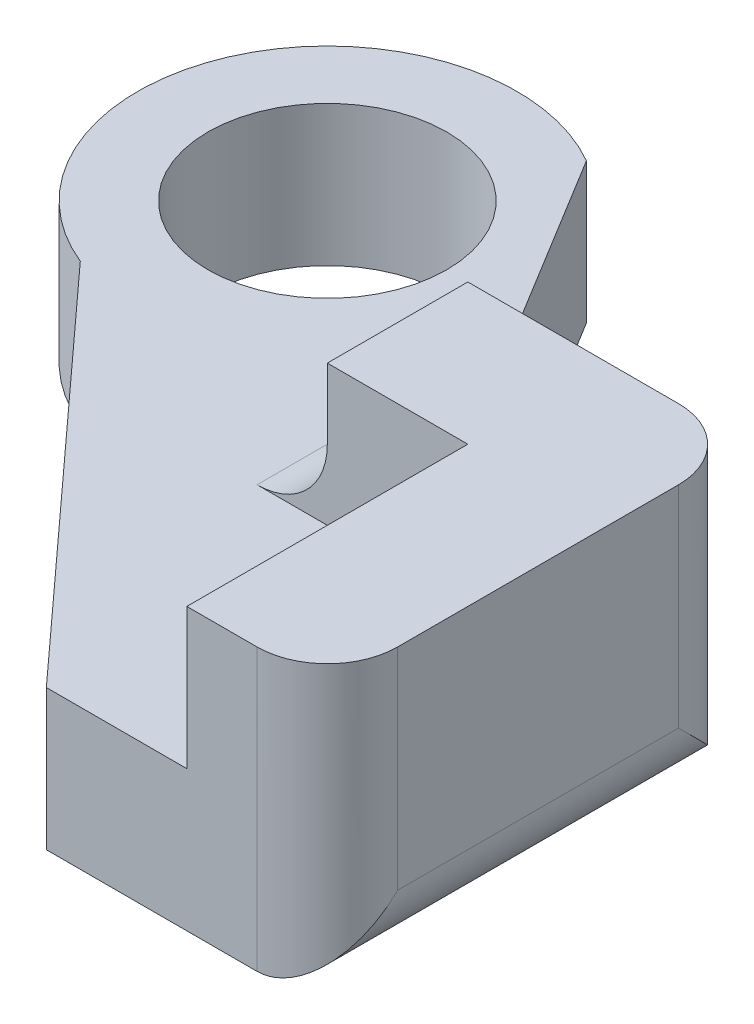
ISO-10303-21;
HEADER;
FILE_DESCRIPTION(('STEP AP214'),'2;1');
FILE_NAME('part.step','',(''),(''),'','','');
FILE_SCHEMA(('AUTOMOTIVE_DESIGN { 1 0 10303 214 1 1 1 1 }'));
ENDSEC;
DATA;
#1=APPLICATION_CONTEXT('core data for automotive mechanical design processes');
#2=APPLICATION_PROTOCOL_DEFINITION('international standard','automotive_design',2000,#1);
#3=PRODUCT_CONTEXT('',#1,'mechanical');
#4=PRODUCT('Part','Part','',(#3));
#5=PRODUCT_RELATED_PRODUCT_CATEGORY('part','',(#4));
#6=PRODUCT_DEFINITION_FORMATION('','',#4);
#7=PRODUCT_DEFINITION_CONTEXT('part definition',#1,'design');
#8=PRODUCT_DEFINITION('design','',#6,#7);
#9=PRODUCT_DEFINITION_SHAPE('','',#8);
#10=(LENGTH_UNIT() NAMED_UNIT(*) SI_UNIT(.MILLI.,.METRE.));
#11=(NAMED_UNIT(*) PLANE_ANGLE_UNIT() SI_UNIT($,.RADIAN.));
#12=(NAMED_UNIT(*) SI_UNIT($,.STERADIAN.) SOLID_ANGLE_UNIT());
#13=UNCERTAINTY_MEASURE_WITH_UNIT(LENGTH_MEASURE(1.E-05),#10,'distance_accuracy_value','');
#14=(GEOMETRIC_REPRESENTATION_CONTEXT(3) GLOBAL_UNCERTAINTY_ASSIGNED_CONTEXT((#13)) GLOBAL_UNIT_ASSIGNED_CONTEXT((#10,
#11,#12)) REPRESENTATION_CONTEXT('',''));
#15=CARTESIAN_POINT('',(0.,0.,0.));
#16=DIRECTION('',(0.,0.,1.));
#17=DIRECTION('',(1.,0.,0.));
#18=AXIS2_PLACEMENT_3D('',#15,#16,#17);
#19=CARTESIAN_POINT('',(0.,10.,0.));
#20=DIRECTION('',(1.,0.,0.));
#21=DIRECTION('',(0.,0.,-1.));
#22=AXIS2_PLACEMENT_3D('',#19,#20,#21);
#23=PLANE('',#22);
#24=DIRECTION('',(0.,-1.,0.));
#25=VECTOR('',#24,1.);
#26=CARTESIAN_POINT('',(0.,10.,0.));
#27=LINE('',#26,#25);
#28=CARTESIAN_POINT('',(0.,20.,0.));
#29=VERTEX_POINT('',#28);
#30=CARTESIAN_POINT('',(0.,15.,0.));
#31=VERTEX_POINT('',#30);
#32=EDGE_CURVE('E224',#29,#31,#27,.T.);
#33=ORIENTED_EDGE('',*,*,#32,.T.);
#34=DIRECTION('',(0.,0.,-1.));
#35=VECTOR('',#34,1.);
#36=CARTESIAN_POINT('',(0.,15.,0.));
#37=LINE('',#36,#35);
#38=CARTESIAN_POINT('',(0.,15.,10.));
#39=VERTEX_POINT('',#38);
#40=EDGE_CURVE('E239',#31,#39,#37,.F.);
#41=ORIENTED_EDGE('',*,*,#40,.T.);
#42=DIRECTION('',(0.,-1.,0.));
#43=VECTOR('',#42,1.);
#44=CARTESIAN_POINT('',(0.,20.,10.));
#45=LINE('',#44,#43);
#46=CARTESIAN_POINT('',(0.,20.,10.));
#47=VERTEX_POINT('',#46);
#48=EDGE_CURVE('E216',#47,#39,#45,.T.);
#49=ORIENTED_EDGE('',*,*,#48,.F.);
#50=DIRECTION('',(0.,0.,1.));
#51=VECTOR('',#50,1.);
#52=CARTESIAN_POINT('',(0.,20.,0.));
#53=LINE('',#52,#51);
#54=EDGE_CURVE('E185',#29,#47,#53,.T.);
#55=ORIENTED_EDGE('',*,*,#54,.F.);
#56=EDGE_LOOP('',(#33,#41,#49,#55));
#57=FACE_BOUND('',#56,.T.);
#58=ADVANCED_FACE('F39',(#57),#23,.F.);
#59=CARTESIAN_POINT('',(0.,10.,30.));
#60=DIRECTION('',(0.,0.,-1.));
#61=DIRECTION('',(-1.,0.,0.));
#62=AXIS2_PLACEMENT_3D('',#59,#60,#61);
#63=PLANE('',#62);
#64=DIRECTION('',(1.,0.,0.));
#65=VECTOR('',#64,1.);
#66=CARTESIAN_POINT('',(0.,0.,30.));
#67=LINE('',#66,#65);
#68=CARTESIAN_POINT('',(0.,0.,30.));
#69=VERTEX_POINT('',#68);
#70=CARTESIAN_POINT('',(15.,0.,30.));
#71=VERTEX_POINT('',#70);
#72=EDGE_CURVE('E220',#69,#71,#67,.T.);
#73=ORIENTED_EDGE('',*,*,#72,.T.);
#74=DIRECTION('',(0.,-1.,0.));
#75=VECTOR('',#74,1.);
#76=CARTESIAN_POINT('',(15.,10.,30.));
#77=LINE('',#76,#75);
#78=CARTESIAN_POINT('',(15.,20.,30.));
#79=VERTEX_POINT('',#78);
#80=EDGE_CURVE('E255',#71,#79,#77,.F.);
#81=ORIENTED_EDGE('',*,*,#80,.T.);
#82=DIRECTION('',(1.,0.,0.));
#83=VECTOR('',#82,1.);
#84=CARTESIAN_POINT('',(10.,20.,30.));
#85=LINE('',#84,#83);
#86=CARTESIAN_POINT('',(10.,20.,30.));
#87=VERTEX_POINT('',#86);
#88=EDGE_CURVE('E195',#87,#79,#85,.T.);
#89=ORIENTED_EDGE('',*,*,#88,.F.);
#90=DIRECTION('',(0.,-1.,0.));
#91=VECTOR('',#90,1.);
#92=CARTESIAN_POINT('',(10.,20.,30.));
#93=LINE('',#92,#91);
#94=CARTESIAN_POINT('',(10.,10.,30.));
#95=VERTEX_POINT('',#94);
#96=EDGE_CURVE('E202',#87,#95,#93,.T.);
#97=ORIENTED_EDGE('',*,*,#96,.T.);
#98=DIRECTION('',(1.,0.,0.));
#99=VECTOR('',#98,1.);
#100=CARTESIAN_POINT('',(0.,10.,30.));
#101=LINE('',#100,#99);
#102=CARTESIAN_POINT('',(0.,10.,30.));
#103=VERTEX_POINT('',#102);
#104=EDGE_CURVE('E221',#103,#95,#101,.T.);
#105=ORIENTED_EDGE('',*,*,#104,.F.);
#106=DIRECTION('',(0.,-1.,0.));
#107=VECTOR('',#106,1.);
#108=CARTESIAN_POINT('',(0.,10.,30.));
#109=LINE('',#108,#107);
#110=EDGE_CURVE('E233',#103,#69,#109,.T.);
#111=ORIENTED_EDGE('',*,*,#110,.T.);
#112=EDGE_LOOP('',(#73,#81,#89,#97,#105,#111));
#113=FACE_BOUND('',#112,.T.);
#114=ADVANCED_FACE('F316',(#113),#63,.F.);
#115=CARTESIAN_POINT('',(20.,10.,0.));
#116=DIRECTION('',(-1.,0.,0.));
#117=DIRECTION('',(0.,0.,1.));
#118=AXIS2_PLACEMENT_3D('',#115,#116,#117);
#119=PLANE('',#118);
#120=DIRECTION('',(0.,0.,-1.));
#121=VECTOR('',#120,1.);
#122=CARTESIAN_POINT('',(20.,20.,30.));
#123=LINE('',#122,#121);
#124=CARTESIAN_POINT('',(20.,20.,25.));
#125=VERTEX_POINT('',#124);
#126=CARTESIAN_POINT('',(20.,20.,5.));
#127=VERTEX_POINT('',#126);
#128=EDGE_CURVE('E199',#125,#127,#123,.T.);
#129=ORIENTED_EDGE('',*,*,#128,.F.);
#130=DIRECTION('',(0.,-1.,0.));
#131=VECTOR('',#130,1.);
#132=CARTESIAN_POINT('',(20.,10.,25.));
#133=LINE('',#132,#131);
#134=CARTESIAN_POINT('',(20.,5.,25.));
#135=VERTEX_POINT('',#134);
#136=EDGE_CURVE('E249',#125,#135,#133,.T.);
#137=ORIENTED_EDGE('',*,*,#136,.T.);
#138=DIRECTION('',(0.,0.,-1.));
#139=VECTOR('',#138,1.);
#140=CARTESIAN_POINT('',(20.,5.,0.));
#141=LINE('',#140,#139);
#142=CARTESIAN_POINT('',(20.,5.,5.));
#143=VERTEX_POINT('',#142);
#144=EDGE_CURVE('E245',#135,#143,#141,.T.);
#145=ORIENTED_EDGE('',*,*,#144,.T.);
#146=DIRECTION('',(0.,-1.,0.));
#147=VECTOR('',#146,1.);
#148=CARTESIAN_POINT('',(20.,10.,5.));
#149=LINE('',#148,#147);
#150=EDGE_CURVE('E242',#143,#127,#149,.F.);
#151=ORIENTED_EDGE('',*,*,#150,.T.);
#152=EDGE_LOOP('',(#129,#137,#145,#151));
#153=FACE_BOUND('',#152,.T.);
#154=ADVANCED_FACE('F309',(#153),#119,.F.);
#155=CARTESIAN_POINT('',(0.,10.,0.));
#156=DIRECTION('',(0.,0.,1.));
#157=DIRECTION('',(1.,0.,0.));
#158=AXIS2_PLACEMENT_3D('',#155,#156,#157);
#159=PLANE('',#158);
#160=DIRECTION('',(-1.,0.,0.));
#161=VECTOR('',#160,1.);
#162=CARTESIAN_POINT('',(20.,20.,0.));
#163=LINE('',#162,#161);
#164=CARTESIAN_POINT('',(15.,20.,0.));
#165=VERTEX_POINT('',#164);
#166=EDGE_CURVE('E182',#165,#29,#163,.T.);
#167=ORIENTED_EDGE('',*,*,#166,.F.);
#168=DIRECTION('',(0.,-1.,0.));
#169=VECTOR('',#168,1.);
#170=CARTESIAN_POINT('',(15.,10.,0.));
#171=LINE('',#170,#169);
#172=CARTESIAN_POINT('',(15.,0.,0.));
#173=VERTEX_POINT('',#172);
#174=EDGE_CURVE('E263',#165,#173,#171,.T.);
#175=ORIENTED_EDGE('',*,*,#174,.T.);
#176=DIRECTION('',(-1.,0.,0.));
#177=VECTOR('',#176,1.);
#178=CARTESIAN_POINT('',(0.,0.,0.));
#179=LINE('',#178,#177);
#180=CARTESIAN_POINT('',(0.,0.,0.));
#181=VERTEX_POINT('',#180);
#182=EDGE_CURVE('E225',#173,#181,#179,.T.);
#183=ORIENTED_EDGE('',*,*,#182,.T.);
#184=DIRECTION('',(0.,1.,0.));
#185=VECTOR('',#184,1.);
#186=CARTESIAN_POINT('',(0.,-63.1228960045402,0.));
#187=LINE('',#186,#185);
#188=EDGE_CURVE('E57',#181,#31,#187,.T.);
#189=ORIENTED_EDGE('',*,*,#188,.T.);
#190=ORIENTED_EDGE('',*,*,#32,.F.);
#191=EDGE_LOOP('',(#167,#175,#183,#189,#190));
#192=FACE_BOUND('',#191,.T.);
#193=ADVANCED_FACE('F307',(#192),#159,.F.);
#194=CARTESIAN_POINT('',(0.,10.,0.));
#195=DIRECTION('',(0.,1.,0.));
#196=DIRECTION('',(0.,0.,1.));
#197=AXIS2_PLACEMENT_3D('',#194,#195,#196);
#198=PLANE('',#197);
#199=DIRECTION('',(1.,0.,0.));
#200=VECTOR('',#199,1.);
#201=CARTESIAN_POINT('',(0.,10.,10.));
#202=LINE('',#201,#200);
#203=CARTESIAN_POINT('',(-5.,10.,10.));
#204=VERTEX_POINT('',#203);
#205=CARTESIAN_POINT('',(10.,10.,10.));
#206=VERTEX_POINT('',#205);
#207=EDGE_CURVE('E181',#204,#206,#202,.T.);
#208=ORIENTED_EDGE('',*,*,#207,.F.);
#209=DIRECTION('',(0.,0.,-1.));
#210=VECTOR('',#209,1.);
#211=CARTESIAN_POINT('',(-5.,10.,0.));
#212=LINE('',#211,#210);
#213=CARTESIAN_POINT('',(-5.,10.,-8.18658521127101));
#214=VERTEX_POINT('',#213);
#215=EDGE_CURVE('E146',#204,#214,#212,.T.);
#216=ORIENTED_EDGE('',*,*,#215,.T.);
#217=DIRECTION('',(-0.521228880369973,0.,-0.853416928744833));
#218=VECTOR('',#217,1.);
#219=CARTESIAN_POINT('',(0.,10.,0.));
#220=LINE('',#219,#218);
#221=CARTESIAN_POINT('',(-13.2470675031584,10.,-21.689649382813));
#222=VERTEX_POINT('',#221);
#223=EDGE_CURVE('E137',#214,#222,#220,.T.);
#224=ORIENTED_EDGE('',*,*,#223,.T.);
#225=CARTESIAN_POINT('',(-20.,10.,-10.));
#226=DIRECTION('',(0.,1.,0.));
#227=DIRECTION('',(0.,0.,1.));
#228=AXIS2_PLACEMENT_3D('',#225,#226,#227);
#229=CIRCLE('',#228,13.5);
#230=CARTESIAN_POINT('',(-25.0721160834784,10.,2.51094074942888));
#231=VERTEX_POINT('',#230);
#232=EDGE_CURVE('E143',#222,#231,#229,.T.);
#233=ORIENTED_EDGE('',*,*,#232,.T.);
#234=DIRECTION('',(0.673879510691073,0.,0.738841258370674));
#235=VECTOR('',#234,1.);
#236=CARTESIAN_POINT('',(0.,10.,30.));
#237=LINE('',#236,#235);
#238=EDGE_CURVE('E166',#231,#103,#237,.T.);
#239=ORIENTED_EDGE('',*,*,#238,.T.);
#240=ORIENTED_EDGE('',*,*,#104,.T.);
#241=DIRECTION('',(0.,0.,1.));
#242=VECTOR('',#241,1.);
#243=CARTESIAN_POINT('',(10.,10.,10.));
#244=LINE('',#243,#242);
#245=EDGE_CURVE('E186',#206,#95,#244,.T.);
#246=ORIENTED_EDGE('',*,*,#245,.F.);
#247=EDGE_LOOP('',(#208,#216,#224,#233,#239,#240,#246));
#248=FACE_BOUND('',#247,.T.);
#249=CARTESIAN_POINT('',(-20.,10.,-10.));
#250=DIRECTION('',(0.,1.,0.));
#251=DIRECTION('',(0.,0.,1.));
#252=AXIS2_PLACEMENT_3D('',#249,#250,#251);
#253=CIRCLE('',#252,8.5);
#254=CARTESIAN_POINT('',(-20.,10.,-1.5));
#255=VERTEX_POINT('',#254);
#256=EDGE_CURVE('E150',#255,#255,#253,.T.);
#257=ORIENTED_EDGE('',*,*,#256,.F.);
#258=EDGE_LOOP('',(#257));
#259=FACE_BOUND('',#258,.T.);
#260=ADVANCED_FACE('F139',(#248,#259),#198,.T.);
#261=CARTESIAN_POINT('',(0.,0.,0.));
#262=DIRECTION('',(0.,1.,0.));
#263=DIRECTION('',(0.,0.,1.));
#264=AXIS2_PLACEMENT_3D('',#261,#262,#263);
#265=PLANE('',#264);
#266=ORIENTED_EDGE('',*,*,#182,.F.);
#267=DIRECTION('',(0.,0.,-1.));
#268=VECTOR('',#267,1.);
#269=CARTESIAN_POINT('',(15.,0.,0.));
#270=LINE('',#269,#268);
#271=EDGE_CURVE('E252',#173,#71,#270,.F.);
#272=ORIENTED_EDGE('',*,*,#271,.T.);
#273=ORIENTED_EDGE('',*,*,#72,.F.);
#274=DIRECTION('',(-0.673879510691073,0.,-0.738841258370674));
#275=VECTOR('',#274,1.);
#276=CARTESIAN_POINT('',(0.,0.,30.));
#277=LINE('',#276,#275);
#278=CARTESIAN_POINT('',(-25.0721160834784,0.,2.51094074942888));
#279=VERTEX_POINT('',#278);
#280=EDGE_CURVE('E282',#69,#279,#277,.T.);
#281=ORIENTED_EDGE('',*,*,#280,.T.);
#282=CARTESIAN_POINT('',(-20.,0.,-10.));
#283=DIRECTION('',(0.,1.,0.));
#284=DIRECTION('',(0.,0.,1.));
#285=AXIS2_PLACEMENT_3D('',#282,#283,#284);
#286=CIRCLE('',#285,13.5);
#287=CARTESIAN_POINT('',(-13.2470675031584,0.,-21.689649382813));
#288=VERTEX_POINT('',#287);
#289=EDGE_CURVE('E173',#279,#288,#286,.F.);
#290=ORIENTED_EDGE('',*,*,#289,.T.);
#291=DIRECTION('',(0.521228880369973,0.,0.853416928744833));
#292=VECTOR('',#291,1.);
#293=CARTESIAN_POINT('',(0.,0.,0.));
#294=LINE('',#293,#292);
#295=EDGE_CURVE('E157',#288,#181,#294,.T.);
#296=ORIENTED_EDGE('',*,*,#295,.T.);
#297=EDGE_LOOP('',(#266,#272,#273,#281,#290,#296));
#298=FACE_BOUND('',#297,.T.);
#299=CARTESIAN_POINT('',(-20.,0.,-10.));
#300=DIRECTION('',(0.,1.,0.));
#301=DIRECTION('',(0.,0.,1.));
#302=AXIS2_PLACEMENT_3D('',#299,#300,#301);
#303=CIRCLE('',#302,8.5);
#304=CARTESIAN_POINT('',(-20.,0.,-1.5));
#305=VERTEX_POINT('',#304);
#306=EDGE_CURVE('E177',#305,#305,#303,.F.);
#307=ORIENTED_EDGE('',*,*,#306,.F.);
#308=EDGE_LOOP('',(#307));
#309=FACE_BOUND('',#308,.T.);
#310=ADVANCED_FACE('F290',(#298,#309),#265,.F.);
#311=CARTESIAN_POINT('',(0.,20.,10.));
#312=DIRECTION('',(0.,0.,-1.));
#313=DIRECTION('',(-1.,0.,0.));
#314=AXIS2_PLACEMENT_3D('',#311,#312,#313);
#315=PLANE('',#314);
#316=ORIENTED_EDGE('',*,*,#207,.T.);
#317=DIRECTION('',(0.,-1.,0.));
#318=VECTOR('',#317,1.);
#319=CARTESIAN_POINT('',(10.,20.,10.));
#320=LINE('',#319,#318);
#321=CARTESIAN_POINT('',(10.,20.,10.));
#322=VERTEX_POINT('',#321);
#323=EDGE_CURVE('E212',#322,#206,#320,.T.);
#324=ORIENTED_EDGE('',*,*,#323,.F.);
#325=DIRECTION('',(1.,0.,0.));
#326=VECTOR('',#325,1.);
#327=CARTESIAN_POINT('',(0.,20.,10.));
#328=LINE('',#327,#326);
#329=EDGE_CURVE('E189',#47,#322,#328,.T.);
#330=ORIENTED_EDGE('',*,*,#329,.F.);
#331=ORIENTED_EDGE('',*,*,#48,.T.);
#332=CARTESIAN_POINT('',(-5.,15.,10.));
#333=DIRECTION('',(0.,0.,-1.));
#334=DIRECTION('',(-1.,0.,0.));
#335=AXIS2_PLACEMENT_3D('',#332,#333,#334);
#336=CIRCLE('',#335,5.);
#337=EDGE_CURVE('E11',#39,#204,#336,.T.);
#338=ORIENTED_EDGE('',*,*,#337,.T.);
#339=EDGE_LOOP('',(#316,#324,#330,#331,#338));
#340=FACE_BOUND('',#339,.T.);
#341=ADVANCED_FACE('F301',(#340),#315,.F.);
#342=CARTESIAN_POINT('',(10.,20.,10.));
#343=DIRECTION('',(1.,0.,0.));
#344=DIRECTION('',(0.,0.,-1.));
#345=AXIS2_PLACEMENT_3D('',#342,#343,#344);
#346=PLANE('',#345);
#347=ORIENTED_EDGE('',*,*,#245,.T.);
#348=ORIENTED_EDGE('',*,*,#96,.F.);
#349=DIRECTION('',(0.,0.,1.));
#350=VECTOR('',#349,1.);
#351=CARTESIAN_POINT('',(10.,20.,10.));
#352=LINE('',#351,#350);
#353=EDGE_CURVE('E192',#322,#87,#352,.T.);
#354=ORIENTED_EDGE('',*,*,#353,.F.);
#355=ORIENTED_EDGE('',*,*,#323,.T.);
#356=EDGE_LOOP('',(#347,#348,#354,#355));
#357=FACE_BOUND('',#356,.T.);
#358=ADVANCED_FACE('F350',(#357),#346,.F.);
#359=CARTESIAN_POINT('',(0.,20.,0.));
#360=DIRECTION('',(0.,1.,0.));
#361=DIRECTION('',(0.,0.,1.));
#362=AXIS2_PLACEMENT_3D('',#359,#360,#361);
#363=PLANE('',#362);
#364=ORIENTED_EDGE('',*,*,#88,.T.);
#365=CARTESIAN_POINT('',(15.,20.,25.));
#366=DIRECTION('',(0.,1.,0.));
#367=DIRECTION('',(0.,0.,1.));
#368=AXIS2_PLACEMENT_3D('',#365,#366,#367);
#369=CIRCLE('',#368,5.);
#370=EDGE_CURVE('E260',#79,#125,#369,.T.);
#371=ORIENTED_EDGE('',*,*,#370,.T.);
#372=ORIENTED_EDGE('',*,*,#128,.T.);
#373=CARTESIAN_POINT('',(15.,20.,5.));
#374=DIRECTION('',(0.,1.,0.));
#375=DIRECTION('',(0.,0.,1.));
#376=AXIS2_PLACEMENT_3D('',#373,#374,#375);
#377=CIRCLE('',#376,5.);
#378=EDGE_CURVE('E65',#127,#165,#377,.T.);
#379=ORIENTED_EDGE('',*,*,#378,.T.);
#380=ORIENTED_EDGE('',*,*,#166,.T.);
#381=ORIENTED_EDGE('',*,*,#54,.T.);
#382=ORIENTED_EDGE('',*,*,#329,.T.);
#383=ORIENTED_EDGE('',*,*,#353,.T.);
#384=EDGE_LOOP('',(#364,#371,#372,#379,#380,#381,#382,#383));
#385=FACE_BOUND('',#384,.T.);
#386=ADVANCED_FACE('F304',(#385),#363,.T.);
#387=CARTESIAN_POINT('',(0.,-63.1228960045402,0.));
#388=DIRECTION('',(0.853416928744834,0.,-0.521228880369973));
#389=DIRECTION('',(-0.521228880369973,0.,-0.853416928744833));
#390=AXIS2_PLACEMENT_3D('',#387,#388,#389);
#391=PLANE('',#390);
#392=ORIENTED_EDGE('',*,*,#295,.F.);
#393=DIRECTION('',(0.,1.,0.));
#394=VECTOR('',#393,1.);
#395=CARTESIAN_POINT('',(-13.2470675031584,-63.1228960045402,-21.689649382813));
#396=LINE('',#395,#394);
#397=EDGE_CURVE('E154',#288,#222,#396,.T.);
#398=ORIENTED_EDGE('',*,*,#397,.T.);
#399=ORIENTED_EDGE('',*,*,#223,.F.);
#400=CARTESIAN_POINT('',(-5.,15.,-8.18658521127101));
#401=DIRECTION('',(0.853416928744834,0.,-0.521228880369973));
#402=DIRECTION('',(-0.521228880369973,0.,-0.853416928744833));
#403=AXIS2_PLACEMENT_3D('',#400,#401,#402);
#404=ELLIPSE('',#403,9.59271480976064,5.);
#405=EDGE_CURVE('E49',#214,#31,#404,.F.);
#406=ORIENTED_EDGE('',*,*,#405,.T.);
#407=ORIENTED_EDGE('',*,*,#188,.F.);
#408=EDGE_LOOP('',(#392,#398,#399,#406,#407));
#409=FACE_BOUND('',#408,.T.);
#410=ADVANCED_FACE('F155',(#409),#391,.T.);
#411=CARTESIAN_POINT('',(-20.,-63.1228960045402,-10.));
#412=DIRECTION('',(0.,1.,0.));
#413=DIRECTION('',(0.,0.,1.));
#414=AXIS2_PLACEMENT_3D('',#411,#412,#413);
#415=CYLINDRICAL_SURFACE('',#414,13.5);
#416=ORIENTED_EDGE('',*,*,#289,.F.);
#417=DIRECTION('',(0.,1.,0.));
#418=VECTOR('',#417,1.);
#419=CARTESIAN_POINT('',(-25.0721160834784,-63.1228960045402,2.51094074942888));
#420=LINE('',#419,#418);
#421=EDGE_CURVE('E161',#279,#231,#420,.T.);
#422=ORIENTED_EDGE('',*,*,#421,.T.);
#423=ORIENTED_EDGE('',*,*,#232,.F.);
#424=ORIENTED_EDGE('',*,*,#397,.F.);
#425=EDGE_LOOP('',(#416,#422,#423,#424));
#426=FACE_BOUND('',#425,.T.);
#427=ADVANCED_FACE('F163',(#426),#415,.T.);
#428=CARTESIAN_POINT('',(0.,-63.1228960045402,30.));
#429=DIRECTION('',(-0.738841258370674,0.,0.673879510691073));
#430=DIRECTION('',(0.673879510691073,0.,0.738841258370674));
#431=AXIS2_PLACEMENT_3D('',#428,#429,#430);
#432=PLANE('',#431);
#433=ORIENTED_EDGE('',*,*,#280,.F.);
#434=ORIENTED_EDGE('',*,*,#110,.F.);
#435=ORIENTED_EDGE('',*,*,#238,.F.);
#436=ORIENTED_EDGE('',*,*,#421,.F.);
#437=EDGE_LOOP('',(#433,#434,#435,#436));
#438=FACE_BOUND('',#437,.T.);
#439=ADVANCED_FACE('F348',(#438),#432,.T.);
#440=CARTESIAN_POINT('',(-20.,-63.1228960045402,-10.));
#441=DIRECTION('',(0.,1.,0.));
#442=DIRECTION('',(0.,0.,1.));
#443=AXIS2_PLACEMENT_3D('',#440,#441,#442);
#444=CYLINDRICAL_SURFACE('',#443,8.5);
#445=ORIENTED_EDGE('',*,*,#306,.T.);
#446=EDGE_LOOP('',(#445));
#447=FACE_BOUND('',#446,.T.);
#448=ORIENTED_EDGE('',*,*,#256,.T.);
#449=EDGE_LOOP('',(#448));
#450=FACE_BOUND('',#449,.T.);
#451=ADVANCED_FACE('F330',(#447,#450),#444,.F.);
#452=CARTESIAN_POINT('',(-5.,15.,0.));
#453=DIRECTION('',(0.,0.,-1.));
#454=DIRECTION('',(-1.,0.,0.));
#455=AXIS2_PLACEMENT_3D('',#452,#453,#454);
#456=CYLINDRICAL_SURFACE('',#455,5.);
#457=ORIENTED_EDGE('',*,*,#337,.F.);
#458=ORIENTED_EDGE('',*,*,#40,.F.);
#459=ORIENTED_EDGE('',*,*,#405,.F.);
#460=ORIENTED_EDGE('',*,*,#215,.F.);
#461=EDGE_LOOP('',(#457,#458,#459,#460));
#462=FACE_BOUND('',#461,.T.);
#463=ADVANCED_FACE('F295',(#462),#456,.F.);
#464=CARTESIAN_POINT('',(15.,10.,25.));
#465=DIRECTION('',(0.,-1.,0.));
#466=DIRECTION('',(0.,0.,-1.));
#467=AXIS2_PLACEMENT_3D('',#464,#465,#466);
#468=CYLINDRICAL_SURFACE('',#467,5.);
#469=ORIENTED_EDGE('',*,*,#370,.F.);
#470=ORIENTED_EDGE('',*,*,#80,.F.);
#471=CARTESIAN_POINT('',(15.,5.,25.));
#472=DIRECTION('',(0.,-0.707106781186547,-0.707106781186547));
#473=DIRECTION('',(0.,-0.707106781186547,0.707106781186547));
#474=AXIS2_PLACEMENT_3D('',#471,#472,#473);
#475=ELLIPSE('',#474,7.07106781186547,5.);
#476=EDGE_CURVE('E43',#135,#71,#475,.T.);
#477=ORIENTED_EDGE('',*,*,#476,.F.);
#478=ORIENTED_EDGE('',*,*,#136,.F.);
#479=EDGE_LOOP('',(#469,#470,#477,#478));
#480=FACE_BOUND('',#479,.T.);
#481=ADVANCED_FACE('F41',(#480),#468,.T.);
#482=CARTESIAN_POINT('',(15.,10.,5.));
#483=DIRECTION('',(0.,-1.,0.));
#484=DIRECTION('',(0.,0.,-1.));
#485=AXIS2_PLACEMENT_3D('',#482,#483,#484);
#486=CYLINDRICAL_SURFACE('',#485,5.);
#487=ORIENTED_EDGE('',*,*,#378,.F.);
#488=ORIENTED_EDGE('',*,*,#150,.F.);
#489=CARTESIAN_POINT('',(15.,5.,5.));
#490=DIRECTION('',(0.,-0.707106781186547,0.707106781186547));
#491=DIRECTION('',(0.,-0.707106781186547,-0.707106781186547));
#492=AXIS2_PLACEMENT_3D('',#489,#490,#491);
#493=ELLIPSE('',#492,7.07106781186547,5.);
#494=EDGE_CURVE('E267',#173,#143,#493,.T.);
#495=ORIENTED_EDGE('',*,*,#494,.F.);
#496=ORIENTED_EDGE('',*,*,#174,.F.);
#497=EDGE_LOOP('',(#487,#488,#495,#496));
#498=FACE_BOUND('',#497,.T.);
#499=ADVANCED_FACE('F333',(#498),#486,.T.);
#500=CARTESIAN_POINT('',(15.,5.,0.));
#501=DIRECTION('',(0.,0.,-1.));
#502=DIRECTION('',(-1.,0.,0.));
#503=AXIS2_PLACEMENT_3D('',#500,#501,#502);
#504=CYLINDRICAL_SURFACE('',#503,5.);
#505=ORIENTED_EDGE('',*,*,#476,.T.);
#506=ORIENTED_EDGE('',*,*,#271,.F.);
#507=ORIENTED_EDGE('',*,*,#494,.T.);
#508=ORIENTED_EDGE('',*,*,#144,.F.);
#509=EDGE_LOOP('',(#505,#506,#507,#508));
#510=FACE_BOUND('',#509,.T.);
#511=ADVANCED_FACE('F331',(#510),#504,.T.);
#512=CLOSED_SHELL('',(#58,#114,#154,#193,#260,#310,#341,#358,#386,#410,#427,#439,#451,#463,#481,
#499,#511));
#513=MANIFOLD_SOLID_BREP('B2',#512);
#514=ADVANCED_BREP_SHAPE_REPRESENTATION('',(#18,#513),#14);
#515=SHAPE_DEFINITION_REPRESENTATION(#9,#514);
ENDSEC;
END-ISO-10303-21;
